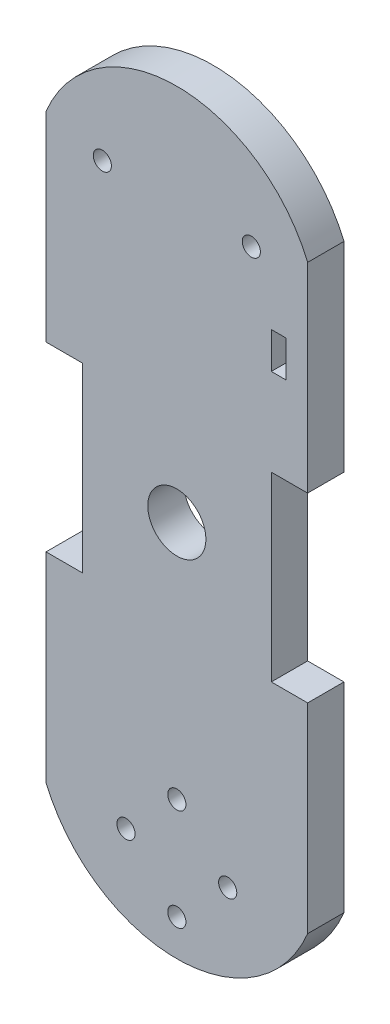
ISO-10303-21;
HEADER;
FILE_DESCRIPTION(('STEP AP214'),'2;1');
FILE_NAME('part.step','',(''),(''),'','','');
FILE_SCHEMA(('AUTOMOTIVE_DESIGN { 1 0 10303 214 1 1 1 1 }'));
ENDSEC;
DATA;
#1=APPLICATION_CONTEXT('core data for automotive mechanical design processes');
#2=APPLICATION_PROTOCOL_DEFINITION('international standard','automotive_design',2000,#1);
#3=PRODUCT_CONTEXT('',#1,'mechanical');
#4=PRODUCT('Part','Part','',(#3));
#5=PRODUCT_RELATED_PRODUCT_CATEGORY('part','',(#4));
#6=PRODUCT_DEFINITION_FORMATION('','',#4);
#7=PRODUCT_DEFINITION_CONTEXT('part definition',#1,'design');
#8=PRODUCT_DEFINITION('design','',#6,#7);
#9=PRODUCT_DEFINITION_SHAPE('','',#8);
#10=(LENGTH_UNIT() NAMED_UNIT(*) SI_UNIT(.MILLI.,.METRE.));
#11=(NAMED_UNIT(*) PLANE_ANGLE_UNIT() SI_UNIT($,.RADIAN.));
#12=(NAMED_UNIT(*) SI_UNIT($,.STERADIAN.) SOLID_ANGLE_UNIT());
#13=UNCERTAINTY_MEASURE_WITH_UNIT(LENGTH_MEASURE(1.E-05),#10,'distance_accuracy_value','');
#14=(GEOMETRIC_REPRESENTATION_CONTEXT(3) GLOBAL_UNCERTAINTY_ASSIGNED_CONTEXT((#13)) GLOBAL_UNIT_ASSIGNED_CONTEXT((#10,
#11,#12)) REPRESENTATION_CONTEXT('',''));
#15=CARTESIAN_POINT('',(0.,0.,0.));
#16=DIRECTION('',(0.,0.,1.));
#17=DIRECTION('',(1.,0.,0.));
#18=AXIS2_PLACEMENT_3D('',#15,#16,#17);
#19=CARTESIAN_POINT('',(0.,7.5,5.));
#20=DIRECTION('',(0.,0.,1.));
#21=DIRECTION('',(1.,0.,0.));
#22=AXIS2_PLACEMENT_3D('',#19,#20,#21);
#23=PLANE('',#22);
#24=CARTESIAN_POINT('',(-10.25,78.,5.));
#25=DIRECTION('',(0.,0.,1.));
#26=DIRECTION('',(1.,0.,0.));
#27=AXIS2_PLACEMENT_3D('',#24,#25,#26);
#28=CIRCLE('',#27,1.25);
#29=CARTESIAN_POINT('',(-9.00000000000001,78.,5.));
#30=VERTEX_POINT('',#29);
#31=EDGE_CURVE('E212',#30,#30,#28,.T.);
#32=ORIENTED_EDGE('',*,*,#31,.F.);
#33=EDGE_LOOP('',(#32));
#34=FACE_BOUND('',#33,.T.);
#35=CARTESIAN_POINT('',(-7.,0.,5.));
#36=DIRECTION('',(0.,0.,1.));
#37=DIRECTION('',(1.,0.,0.));
#38=AXIS2_PLACEMENT_3D('',#35,#36,#37);
#39=CIRCLE('',#38,1.25);
#40=CARTESIAN_POINT('',(-5.75,0.,5.));
#41=VERTEX_POINT('',#40);
#42=EDGE_CURVE('E228',#41,#41,#39,.T.);
#43=ORIENTED_EDGE('',*,*,#42,.F.);
#44=EDGE_LOOP('',(#43));
#45=FACE_BOUND('',#44,.T.);
#46=CARTESIAN_POINT('',(7.,0.,5.));
#47=DIRECTION('',(0.,0.,1.));
#48=DIRECTION('',(1.,0.,0.));
#49=AXIS2_PLACEMENT_3D('',#46,#47,#48);
#50=CIRCLE('',#49,1.25);
#51=CARTESIAN_POINT('',(8.25,0.,5.));
#52=VERTEX_POINT('',#51);
#53=EDGE_CURVE('E244',#52,#52,#50,.T.);
#54=ORIENTED_EDGE('',*,*,#53,.F.);
#55=EDGE_LOOP('',(#54));
#56=FACE_BOUND('',#55,.T.);
#57=CARTESIAN_POINT('',(0.,7.5,5.));
#58=DIRECTION('',(0.,0.,1.));
#59=DIRECTION('',(1.,0.,0.));
#60=AXIS2_PLACEMENT_3D('',#57,#58,#59);
#61=CIRCLE('',#60,19.5);
#62=CARTESIAN_POINT('',(-18.,0.,5.));
#63=VERTEX_POINT('',#62);
#64=CARTESIAN_POINT('',(18.,0.,5.));
#65=VERTEX_POINT('',#64);
#66=EDGE_CURVE('E260',#63,#65,#61,.T.);
#67=ORIENTED_EDGE('',*,*,#66,.T.);
#68=DIRECTION('',(0.,1.,0.));
#69=VECTOR('',#68,1.);
#70=CARTESIAN_POINT('',(18.,27.5,5.));
#71=LINE('',#70,#69);
#72=CARTESIAN_POINT('',(18.,27.5,5.));
#73=VERTEX_POINT('',#72);
#74=EDGE_CURVE('E264',#65,#73,#71,.T.);
#75=ORIENTED_EDGE('',*,*,#74,.T.);
#76=DIRECTION('',(-1.,0.,0.));
#77=VECTOR('',#76,1.);
#78=CARTESIAN_POINT('',(13.,27.5,5.));
#79=LINE('',#78,#77);
#80=CARTESIAN_POINT('',(13.,27.5,5.));
#81=VERTEX_POINT('',#80);
#82=EDGE_CURVE('E268',#73,#81,#79,.T.);
#83=ORIENTED_EDGE('',*,*,#82,.T.);
#84=DIRECTION('',(0.,1.,0.));
#85=VECTOR('',#84,1.);
#86=CARTESIAN_POINT('',(13.,52.5,5.));
#87=LINE('',#86,#85);
#88=CARTESIAN_POINT('',(13.,52.5,5.));
#89=VERTEX_POINT('',#88);
#90=EDGE_CURVE('E271',#81,#89,#87,.T.);
#91=ORIENTED_EDGE('',*,*,#90,.T.);
#92=DIRECTION('',(1.,0.,0.));
#93=VECTOR('',#92,1.);
#94=CARTESIAN_POINT('',(18.,52.5,5.));
#95=LINE('',#94,#93);
#96=CARTESIAN_POINT('',(18.,52.5,5.));
#97=VERTEX_POINT('',#96);
#98=EDGE_CURVE('E274',#89,#97,#95,.T.);
#99=ORIENTED_EDGE('',*,*,#98,.T.);
#100=DIRECTION('',(0.,1.,0.));
#101=VECTOR('',#100,1.);
#102=CARTESIAN_POINT('',(18.,80.,5.));
#103=LINE('',#102,#101);
#104=CARTESIAN_POINT('',(18.,80.,5.));
#105=VERTEX_POINT('',#104);
#106=EDGE_CURVE('E277',#97,#105,#103,.T.);
#107=ORIENTED_EDGE('',*,*,#106,.T.);
#108=CARTESIAN_POINT('',(0.,72.5,5.));
#109=DIRECTION('',(0.,0.,1.));
#110=DIRECTION('',(-1.,0.,0.));
#111=AXIS2_PLACEMENT_3D('',#108,#109,#110);
#112=CIRCLE('',#111,19.5);
#113=CARTESIAN_POINT('',(-18.,80.,5.));
#114=VERTEX_POINT('',#113);
#115=EDGE_CURVE('E280',#105,#114,#112,.T.);
#116=ORIENTED_EDGE('',*,*,#115,.T.);
#117=DIRECTION('',(0.,-1.,0.));
#118=VECTOR('',#117,1.);
#119=CARTESIAN_POINT('',(-18.,80.,5.));
#120=LINE('',#119,#118);
#121=CARTESIAN_POINT('',(-18.,52.5,5.));
#122=VERTEX_POINT('',#121);
#123=EDGE_CURVE('E283',#114,#122,#120,.T.);
#124=ORIENTED_EDGE('',*,*,#123,.T.);
#125=DIRECTION('',(1.,0.,0.));
#126=VECTOR('',#125,1.);
#127=CARTESIAN_POINT('',(-18.,52.5,5.));
#128=LINE('',#127,#126);
#129=CARTESIAN_POINT('',(-13.,52.5,5.));
#130=VERTEX_POINT('',#129);
#131=EDGE_CURVE('E286',#122,#130,#128,.T.);
#132=ORIENTED_EDGE('',*,*,#131,.T.);
#133=DIRECTION('',(0.,-1.,0.));
#134=VECTOR('',#133,1.);
#135=CARTESIAN_POINT('',(-13.,52.5,5.));
#136=LINE('',#135,#134);
#137=CARTESIAN_POINT('',(-13.,27.5,5.));
#138=VERTEX_POINT('',#137);
#139=EDGE_CURVE('E289',#130,#138,#136,.T.);
#140=ORIENTED_EDGE('',*,*,#139,.T.);
#141=DIRECTION('',(-1.,0.,0.));
#142=VECTOR('',#141,1.);
#143=CARTESIAN_POINT('',(-13.,27.5,5.));
#144=LINE('',#143,#142);
#145=CARTESIAN_POINT('',(-18.,27.5,5.));
#146=VERTEX_POINT('',#145);
#147=EDGE_CURVE('E292',#138,#146,#144,.T.);
#148=ORIENTED_EDGE('',*,*,#147,.T.);
#149=DIRECTION('',(0.,-1.,0.));
#150=VECTOR('',#149,1.);
#151=CARTESIAN_POINT('',(-18.,27.5,5.));
#152=LINE('',#151,#150);
#153=EDGE_CURVE('E295',#146,#63,#152,.T.);
#154=ORIENTED_EDGE('',*,*,#153,.T.);
#155=EDGE_LOOP('',(#67,#75,#83,#91,#99,#107,#116,#124,#132,#140,#148,#154));
#156=FACE_BOUND('',#155,.T.);
#157=CARTESIAN_POINT('',(0.,7.,5.));
#158=DIRECTION('',(0.,0.,1.));
#159=DIRECTION('',(1.,0.,0.));
#160=AXIS2_PLACEMENT_3D('',#157,#158,#159);
#161=CIRCLE('',#160,1.25);
#162=CARTESIAN_POINT('',(1.25,7.,5.));
#163=VERTEX_POINT('',#162);
#164=EDGE_CURVE('E252',#163,#163,#161,.T.);
#165=ORIENTED_EDGE('',*,*,#164,.F.);
#166=EDGE_LOOP('',(#165));
#167=FACE_BOUND('',#166,.T.);
#168=CARTESIAN_POINT('',(0.,-7.,5.));
#169=DIRECTION('',(0.,0.,1.));
#170=DIRECTION('',(1.,0.,0.));
#171=AXIS2_PLACEMENT_3D('',#168,#169,#170);
#172=CIRCLE('',#171,1.25);
#173=CARTESIAN_POINT('',(1.25,-7.,5.));
#174=VERTEX_POINT('',#173);
#175=EDGE_CURVE('E236',#174,#174,#172,.T.);
#176=ORIENTED_EDGE('',*,*,#175,.F.);
#177=EDGE_LOOP('',(#176));
#178=FACE_BOUND('',#177,.T.);
#179=CARTESIAN_POINT('',(0.,40.,5.));
#180=DIRECTION('',(0.,0.,1.));
#181=DIRECTION('',(1.,0.,0.));
#182=AXIS2_PLACEMENT_3D('',#179,#180,#181);
#183=CIRCLE('',#182,4.);
#184=CARTESIAN_POINT('',(4.,40.,5.));
#185=VERTEX_POINT('',#184);
#186=EDGE_CURVE('E220',#185,#185,#183,.T.);
#187=ORIENTED_EDGE('',*,*,#186,.F.);
#188=EDGE_LOOP('',(#187));
#189=FACE_BOUND('',#188,.T.);
#190=CARTESIAN_POINT('',(10.25,78.,5.));
#191=DIRECTION('',(0.,0.,1.));
#192=DIRECTION('',(1.,0.,0.));
#193=AXIS2_PLACEMENT_3D('',#190,#191,#192);
#194=CIRCLE('',#193,1.25);
#195=CARTESIAN_POINT('',(11.5,78.,5.));
#196=VERTEX_POINT('',#195);
#197=EDGE_CURVE('E204',#196,#196,#194,.T.);
#198=ORIENTED_EDGE('',*,*,#197,.F.);
#199=EDGE_LOOP('',(#198));
#200=FACE_BOUND('',#199,.T.);
#201=DIRECTION('',(1.,0.,0.));
#202=VECTOR('',#201,1.);
#203=CARTESIAN_POINT('',(13.,64.5,5.));
#204=LINE('',#203,#202);
#205=CARTESIAN_POINT('',(13.,64.5,5.));
#206=VERTEX_POINT('',#205);
#207=CARTESIAN_POINT('',(15.,64.5,5.));
#208=VERTEX_POINT('',#207);
#209=EDGE_CURVE('E165',#206,#208,#204,.T.);
#210=ORIENTED_EDGE('',*,*,#209,.F.);
#211=DIRECTION('',(0.,-1.,0.));
#212=VECTOR('',#211,1.);
#213=CARTESIAN_POINT('',(13.,69.5,5.));
#214=LINE('',#213,#212);
#215=CARTESIAN_POINT('',(13.,69.5,5.));
#216=VERTEX_POINT('',#215);
#217=EDGE_CURVE('E156',#216,#206,#214,.T.);
#218=ORIENTED_EDGE('',*,*,#217,.F.);
#219=DIRECTION('',(-1.,0.,0.));
#220=VECTOR('',#219,1.);
#221=CARTESIAN_POINT('',(13.,69.5,5.));
#222=LINE('',#221,#220);
#223=CARTESIAN_POINT('',(15.,69.5,5.));
#224=VERTEX_POINT('',#223);
#225=EDGE_CURVE('E182',#224,#216,#222,.T.);
#226=ORIENTED_EDGE('',*,*,#225,.F.);
#227=DIRECTION('',(0.,1.,0.));
#228=VECTOR('',#227,1.);
#229=CARTESIAN_POINT('',(15.,69.5,5.));
#230=LINE('',#229,#228);
#231=EDGE_CURVE('E178',#208,#224,#230,.T.);
#232=ORIENTED_EDGE('',*,*,#231,.F.);
#233=EDGE_LOOP('',(#210,#218,#226,#232));
#234=FACE_BOUND('',#233,.T.);
#235=ADVANCED_FACE('F42',(#34,#45,#56,#156,#167,#178,#189,#200,#234),#23,.T.);
#236=CARTESIAN_POINT('',(0.,7.5,0.));
#237=DIRECTION('',(0.,0.,1.));
#238=DIRECTION('',(1.,0.,0.));
#239=AXIS2_PLACEMENT_3D('',#236,#237,#238);
#240=PLANE('',#239);
#241=CARTESIAN_POINT('',(10.25,78.,0.));
#242=DIRECTION('',(0.,0.,1.));
#243=DIRECTION('',(1.,0.,0.));
#244=AXIS2_PLACEMENT_3D('',#241,#242,#243);
#245=CIRCLE('',#244,1.25);
#246=CARTESIAN_POINT('',(11.5,78.,0.));
#247=VERTEX_POINT('',#246);
#248=EDGE_CURVE('E174',#247,#247,#245,.T.);
#249=ORIENTED_EDGE('',*,*,#248,.T.);
#250=EDGE_LOOP('',(#249));
#251=FACE_BOUND('',#250,.T.);
#252=CARTESIAN_POINT('',(-10.25,78.,0.));
#253=DIRECTION('',(0.,0.,1.));
#254=DIRECTION('',(1.,0.,0.));
#255=AXIS2_PLACEMENT_3D('',#252,#253,#254);
#256=CIRCLE('',#255,1.25);
#257=CARTESIAN_POINT('',(-9.00000000000001,78.,0.));
#258=VERTEX_POINT('',#257);
#259=EDGE_CURVE('E208',#258,#258,#256,.T.);
#260=ORIENTED_EDGE('',*,*,#259,.T.);
#261=EDGE_LOOP('',(#260));
#262=FACE_BOUND('',#261,.T.);
#263=CARTESIAN_POINT('',(0.,40.,0.));
#264=DIRECTION('',(0.,0.,1.));
#265=DIRECTION('',(1.,0.,0.));
#266=AXIS2_PLACEMENT_3D('',#263,#264,#265);
#267=CIRCLE('',#266,4.);
#268=CARTESIAN_POINT('',(4.,40.,0.));
#269=VERTEX_POINT('',#268);
#270=EDGE_CURVE('E216',#269,#269,#267,.T.);
#271=ORIENTED_EDGE('',*,*,#270,.T.);
#272=EDGE_LOOP('',(#271));
#273=FACE_BOUND('',#272,.T.);
#274=CARTESIAN_POINT('',(-7.,0.,0.));
#275=DIRECTION('',(0.,0.,1.));
#276=DIRECTION('',(1.,0.,0.));
#277=AXIS2_PLACEMENT_3D('',#274,#275,#276);
#278=CIRCLE('',#277,1.25);
#279=CARTESIAN_POINT('',(-5.75,0.,0.));
#280=VERTEX_POINT('',#279);
#281=EDGE_CURVE('E224',#280,#280,#278,.T.);
#282=ORIENTED_EDGE('',*,*,#281,.T.);
#283=EDGE_LOOP('',(#282));
#284=FACE_BOUND('',#283,.T.);
#285=CARTESIAN_POINT('',(0.,-7.,0.));
#286=DIRECTION('',(0.,0.,1.));
#287=DIRECTION('',(1.,0.,0.));
#288=AXIS2_PLACEMENT_3D('',#285,#286,#287);
#289=CIRCLE('',#288,1.25);
#290=CARTESIAN_POINT('',(1.25,-7.,0.));
#291=VERTEX_POINT('',#290);
#292=EDGE_CURVE('E232',#291,#291,#289,.T.);
#293=ORIENTED_EDGE('',*,*,#292,.T.);
#294=EDGE_LOOP('',(#293));
#295=FACE_BOUND('',#294,.T.);
#296=CARTESIAN_POINT('',(7.,0.,0.));
#297=DIRECTION('',(0.,0.,1.));
#298=DIRECTION('',(1.,0.,0.));
#299=AXIS2_PLACEMENT_3D('',#296,#297,#298);
#300=CIRCLE('',#299,1.25);
#301=CARTESIAN_POINT('',(8.25,0.,0.));
#302=VERTEX_POINT('',#301);
#303=EDGE_CURVE('E240',#302,#302,#300,.T.);
#304=ORIENTED_EDGE('',*,*,#303,.T.);
#305=EDGE_LOOP('',(#304));
#306=FACE_BOUND('',#305,.T.);
#307=CARTESIAN_POINT('',(0.,7.,0.));
#308=DIRECTION('',(0.,0.,1.));
#309=DIRECTION('',(1.,0.,0.));
#310=AXIS2_PLACEMENT_3D('',#307,#308,#309);
#311=CIRCLE('',#310,1.25);
#312=CARTESIAN_POINT('',(1.25,7.,0.));
#313=VERTEX_POINT('',#312);
#314=EDGE_CURVE('E248',#313,#313,#311,.T.);
#315=ORIENTED_EDGE('',*,*,#314,.T.);
#316=EDGE_LOOP('',(#315));
#317=FACE_BOUND('',#316,.T.);
#318=CARTESIAN_POINT('',(0.,7.5,0.));
#319=DIRECTION('',(0.,0.,1.));
#320=DIRECTION('',(1.,0.,0.));
#321=AXIS2_PLACEMENT_3D('',#318,#319,#320);
#322=CIRCLE('',#321,19.5);
#323=CARTESIAN_POINT('',(-18.,0.,0.));
#324=VERTEX_POINT('',#323);
#325=CARTESIAN_POINT('',(18.,0.,0.));
#326=VERTEX_POINT('',#325);
#327=EDGE_CURVE('E256',#324,#326,#322,.T.);
#328=ORIENTED_EDGE('',*,*,#327,.F.);
#329=DIRECTION('',(0.,-1.,0.));
#330=VECTOR('',#329,1.);
#331=CARTESIAN_POINT('',(-18.,27.5,0.));
#332=LINE('',#331,#330);
#333=CARTESIAN_POINT('',(-18.,27.5,0.));
#334=VERTEX_POINT('',#333);
#335=EDGE_CURVE('E265',#334,#324,#332,.T.);
#336=ORIENTED_EDGE('',*,*,#335,.F.);
#337=DIRECTION('',(-1.,0.,0.));
#338=VECTOR('',#337,1.);
#339=CARTESIAN_POINT('',(-13.,27.5,0.));
#340=LINE('',#339,#338);
#341=CARTESIAN_POINT('',(-13.,27.5,0.));
#342=VERTEX_POINT('',#341);
#343=EDGE_CURVE('E329',#342,#334,#340,.T.);
#344=ORIENTED_EDGE('',*,*,#343,.F.);
#345=DIRECTION('',(0.,-1.,0.));
#346=VECTOR('',#345,1.);
#347=CARTESIAN_POINT('',(-13.,52.5,0.));
#348=LINE('',#347,#346);
#349=CARTESIAN_POINT('',(-13.,52.5,0.));
#350=VERTEX_POINT('',#349);
#351=EDGE_CURVE('E326',#350,#342,#348,.T.);
#352=ORIENTED_EDGE('',*,*,#351,.F.);
#353=DIRECTION('',(1.,0.,0.));
#354=VECTOR('',#353,1.);
#355=CARTESIAN_POINT('',(-18.,52.5,0.));
#356=LINE('',#355,#354);
#357=CARTESIAN_POINT('',(-18.,52.5,0.));
#358=VERTEX_POINT('',#357);
#359=EDGE_CURVE('E323',#358,#350,#356,.T.);
#360=ORIENTED_EDGE('',*,*,#359,.F.);
#361=DIRECTION('',(0.,-1.,0.));
#362=VECTOR('',#361,1.);
#363=CARTESIAN_POINT('',(-18.,80.,0.));
#364=LINE('',#363,#362);
#365=CARTESIAN_POINT('',(-18.,80.,0.));
#366=VERTEX_POINT('',#365);
#367=EDGE_CURVE('E320',#366,#358,#364,.T.);
#368=ORIENTED_EDGE('',*,*,#367,.F.);
#369=CARTESIAN_POINT('',(0.,72.5,0.));
#370=DIRECTION('',(0.,0.,1.));
#371=DIRECTION('',(-1.,0.,0.));
#372=AXIS2_PLACEMENT_3D('',#369,#370,#371);
#373=CIRCLE('',#372,19.5);
#374=CARTESIAN_POINT('',(18.,80.,0.));
#375=VERTEX_POINT('',#374);
#376=EDGE_CURVE('E317',#375,#366,#373,.T.);
#377=ORIENTED_EDGE('',*,*,#376,.F.);
#378=DIRECTION('',(0.,1.,0.));
#379=VECTOR('',#378,1.);
#380=CARTESIAN_POINT('',(18.,80.,0.));
#381=LINE('',#380,#379);
#382=CARTESIAN_POINT('',(18.,52.5,0.));
#383=VERTEX_POINT('',#382);
#384=EDGE_CURVE('E314',#383,#375,#381,.T.);
#385=ORIENTED_EDGE('',*,*,#384,.F.);
#386=DIRECTION('',(1.,0.,0.));
#387=VECTOR('',#386,1.);
#388=CARTESIAN_POINT('',(18.,52.5,0.));
#389=LINE('',#388,#387);
#390=CARTESIAN_POINT('',(13.,52.5,0.));
#391=VERTEX_POINT('',#390);
#392=EDGE_CURVE('E311',#391,#383,#389,.T.);
#393=ORIENTED_EDGE('',*,*,#392,.F.);
#394=DIRECTION('',(0.,1.,0.));
#395=VECTOR('',#394,1.);
#396=CARTESIAN_POINT('',(13.,52.5,0.));
#397=LINE('',#396,#395);
#398=CARTESIAN_POINT('',(13.,27.5,0.));
#399=VERTEX_POINT('',#398);
#400=EDGE_CURVE('E308',#399,#391,#397,.T.);
#401=ORIENTED_EDGE('',*,*,#400,.F.);
#402=DIRECTION('',(-1.,0.,0.));
#403=VECTOR('',#402,1.);
#404=CARTESIAN_POINT('',(13.,27.5,0.));
#405=LINE('',#404,#403);
#406=CARTESIAN_POINT('',(18.,27.5,0.));
#407=VERTEX_POINT('',#406);
#408=EDGE_CURVE('E305',#407,#399,#405,.T.);
#409=ORIENTED_EDGE('',*,*,#408,.F.);
#410=DIRECTION('',(0.,1.,0.));
#411=VECTOR('',#410,1.);
#412=CARTESIAN_POINT('',(18.,27.5,0.));
#413=LINE('',#412,#411);
#414=EDGE_CURVE('E302',#326,#407,#413,.T.);
#415=ORIENTED_EDGE('',*,*,#414,.F.);
#416=EDGE_LOOP('',(#328,#336,#344,#352,#360,#368,#377,#385,#393,#401,#409,#415));
#417=FACE_BOUND('',#416,.T.);
#418=DIRECTION('',(0.,-1.,0.));
#419=VECTOR('',#418,1.);
#420=CARTESIAN_POINT('',(13.,69.5,0.));
#421=LINE('',#420,#419);
#422=CARTESIAN_POINT('',(13.,69.5,0.));
#423=VERTEX_POINT('',#422);
#424=CARTESIAN_POINT('',(13.,64.5,0.));
#425=VERTEX_POINT('',#424);
#426=EDGE_CURVE('E66',#423,#425,#421,.T.);
#427=ORIENTED_EDGE('',*,*,#426,.T.);
#428=DIRECTION('',(1.,0.,0.));
#429=VECTOR('',#428,1.);
#430=CARTESIAN_POINT('',(13.,64.5,0.));
#431=LINE('',#430,#429);
#432=CARTESIAN_POINT('',(15.,64.5,0.));
#433=VERTEX_POINT('',#432);
#434=EDGE_CURVE('E172',#425,#433,#431,.T.);
#435=ORIENTED_EDGE('',*,*,#434,.T.);
#436=DIRECTION('',(0.,1.,0.));
#437=VECTOR('',#436,1.);
#438=CARTESIAN_POINT('',(15.,69.5,0.));
#439=LINE('',#438,#437);
#440=CARTESIAN_POINT('',(15.,69.5,0.));
#441=VERTEX_POINT('',#440);
#442=EDGE_CURVE('E191',#433,#441,#439,.T.);
#443=ORIENTED_EDGE('',*,*,#442,.T.);
#444=DIRECTION('',(-1.,0.,0.));
#445=VECTOR('',#444,1.);
#446=CARTESIAN_POINT('',(13.,69.5,0.));
#447=LINE('',#446,#445);
#448=EDGE_CURVE('E166',#441,#423,#447,.T.);
#449=ORIENTED_EDGE('',*,*,#448,.T.);
#450=EDGE_LOOP('',(#427,#435,#443,#449));
#451=FACE_BOUND('',#450,.T.);
#452=ADVANCED_FACE('F384',(#251,#262,#273,#284,#295,#306,#317,#417,#451),#240,.F.);
#453=CARTESIAN_POINT('',(0.,7.5,5.));
#454=DIRECTION('',(0.,0.,-1.));
#455=DIRECTION('',(-1.,0.,0.));
#456=AXIS2_PLACEMENT_3D('',#453,#454,#455);
#457=CYLINDRICAL_SURFACE('',#456,19.5);
#458=ORIENTED_EDGE('',*,*,#327,.T.);
#459=DIRECTION('',(0.,0.,-1.));
#460=VECTOR('',#459,1.);
#461=CARTESIAN_POINT('',(18.,0.,5.));
#462=LINE('',#461,#460);
#463=EDGE_CURVE('E11',#65,#326,#462,.T.);
#464=ORIENTED_EDGE('',*,*,#463,.F.);
#465=ORIENTED_EDGE('',*,*,#66,.F.);
#466=DIRECTION('',(0.,0.,-1.));
#467=VECTOR('',#466,1.);
#468=CARTESIAN_POINT('',(-18.,0.,5.));
#469=LINE('',#468,#467);
#470=EDGE_CURVE('E298',#63,#324,#469,.T.);
#471=ORIENTED_EDGE('',*,*,#470,.T.);
#472=EDGE_LOOP('',(#458,#464,#465,#471));
#473=FACE_BOUND('',#472,.T.);
#474=ADVANCED_FACE('F44',(#473),#457,.T.);
#475=CARTESIAN_POINT('',(18.,27.5,5.));
#476=DIRECTION('',(-1.,0.,0.));
#477=DIRECTION('',(0.,0.,1.));
#478=AXIS2_PLACEMENT_3D('',#475,#476,#477);
#479=PLANE('',#478);
#480=ORIENTED_EDGE('',*,*,#414,.T.);
#481=DIRECTION('',(0.,0.,-1.));
#482=VECTOR('',#481,1.);
#483=CARTESIAN_POINT('',(18.,27.5,5.));
#484=LINE('',#483,#482);
#485=EDGE_CURVE('E51',#73,#407,#484,.T.);
#486=ORIENTED_EDGE('',*,*,#485,.F.);
#487=ORIENTED_EDGE('',*,*,#74,.F.);
#488=ORIENTED_EDGE('',*,*,#463,.T.);
#489=EDGE_LOOP('',(#480,#486,#487,#488));
#490=FACE_BOUND('',#489,.T.);
#491=ADVANCED_FACE('F402',(#490),#479,.F.);
#492=CARTESIAN_POINT('',(13.,27.5,5.));
#493=DIRECTION('',(0.,-1.,0.));
#494=DIRECTION('',(0.,0.,-1.));
#495=AXIS2_PLACEMENT_3D('',#492,#493,#494);
#496=PLANE('',#495);
#497=ORIENTED_EDGE('',*,*,#408,.T.);
#498=DIRECTION('',(0.,0.,-1.));
#499=VECTOR('',#498,1.);
#500=CARTESIAN_POINT('',(13.,27.5,5.));
#501=LINE('',#500,#499);
#502=EDGE_CURVE('E369',#81,#399,#501,.T.);
#503=ORIENTED_EDGE('',*,*,#502,.F.);
#504=ORIENTED_EDGE('',*,*,#82,.F.);
#505=ORIENTED_EDGE('',*,*,#485,.T.);
#506=EDGE_LOOP('',(#497,#503,#504,#505));
#507=FACE_BOUND('',#506,.T.);
#508=ADVANCED_FACE('F378',(#507),#496,.F.);
#509=CARTESIAN_POINT('',(13.,52.5,5.));
#510=DIRECTION('',(-1.,0.,0.));
#511=DIRECTION('',(0.,-1.,0.));
#512=AXIS2_PLACEMENT_3D('',#509,#510,#511);
#513=PLANE('',#512);
#514=ORIENTED_EDGE('',*,*,#400,.T.);
#515=DIRECTION('',(0.,0.,-1.));
#516=VECTOR('',#515,1.);
#517=CARTESIAN_POINT('',(13.,52.5,5.));
#518=LINE('',#517,#516);
#519=EDGE_CURVE('E365',#89,#391,#518,.T.);
#520=ORIENTED_EDGE('',*,*,#519,.F.);
#521=ORIENTED_EDGE('',*,*,#90,.F.);
#522=ORIENTED_EDGE('',*,*,#502,.T.);
#523=EDGE_LOOP('',(#514,#520,#521,#522));
#524=FACE_BOUND('',#523,.T.);
#525=ADVANCED_FACE('F390',(#524),#513,.F.);
#526=CARTESIAN_POINT('',(18.,52.5,5.));
#527=DIRECTION('',(0.,1.,0.));
#528=DIRECTION('',(0.,0.,1.));
#529=AXIS2_PLACEMENT_3D('',#526,#527,#528);
#530=PLANE('',#529);
#531=ORIENTED_EDGE('',*,*,#392,.T.);
#532=DIRECTION('',(0.,0.,-1.));
#533=VECTOR('',#532,1.);
#534=CARTESIAN_POINT('',(18.,52.5,5.));
#535=LINE('',#534,#533);
#536=EDGE_CURVE('E361',#97,#383,#535,.T.);
#537=ORIENTED_EDGE('',*,*,#536,.F.);
#538=ORIENTED_EDGE('',*,*,#98,.F.);
#539=ORIENTED_EDGE('',*,*,#519,.T.);
#540=EDGE_LOOP('',(#531,#537,#538,#539));
#541=FACE_BOUND('',#540,.T.);
#542=ADVANCED_FACE('F394',(#541),#530,.F.);
#543=CARTESIAN_POINT('',(18.,80.,5.));
#544=DIRECTION('',(-1.,0.,0.));
#545=DIRECTION('',(0.,0.,1.));
#546=AXIS2_PLACEMENT_3D('',#543,#544,#545);
#547=PLANE('',#546);
#548=ORIENTED_EDGE('',*,*,#384,.T.);
#549=DIRECTION('',(0.,0.,-1.));
#550=VECTOR('',#549,1.);
#551=CARTESIAN_POINT('',(18.,80.,5.));
#552=LINE('',#551,#550);
#553=EDGE_CURVE('E357',#105,#375,#552,.T.);
#554=ORIENTED_EDGE('',*,*,#553,.F.);
#555=ORIENTED_EDGE('',*,*,#106,.F.);
#556=ORIENTED_EDGE('',*,*,#536,.T.);
#557=EDGE_LOOP('',(#548,#554,#555,#556));
#558=FACE_BOUND('',#557,.T.);
#559=ADVANCED_FACE('F435',(#558),#547,.F.);
#560=CARTESIAN_POINT('',(0.,72.5,5.));
#561=DIRECTION('',(0.,0.,-1.));
#562=DIRECTION('',(-1.,0.,0.));
#563=AXIS2_PLACEMENT_3D('',#560,#561,#562);
#564=CYLINDRICAL_SURFACE('',#563,19.5);
#565=ORIENTED_EDGE('',*,*,#376,.T.);
#566=DIRECTION('',(0.,0.,-1.));
#567=VECTOR('',#566,1.);
#568=CARTESIAN_POINT('',(-18.,80.,5.));
#569=LINE('',#568,#567);
#570=EDGE_CURVE('E353',#114,#366,#569,.T.);
#571=ORIENTED_EDGE('',*,*,#570,.F.);
#572=ORIENTED_EDGE('',*,*,#115,.F.);
#573=ORIENTED_EDGE('',*,*,#553,.T.);
#574=EDGE_LOOP('',(#565,#571,#572,#573));
#575=FACE_BOUND('',#574,.T.);
#576=ADVANCED_FACE('F433',(#575),#564,.T.);
#577=CARTESIAN_POINT('',(-18.,80.,5.));
#578=DIRECTION('',(1.,0.,0.));
#579=DIRECTION('',(0.,1.,0.));
#580=AXIS2_PLACEMENT_3D('',#577,#578,#579);
#581=PLANE('',#580);
#582=ORIENTED_EDGE('',*,*,#367,.T.);
#583=DIRECTION('',(0.,0.,-1.));
#584=VECTOR('',#583,1.);
#585=CARTESIAN_POINT('',(-18.,52.5,5.));
#586=LINE('',#585,#584);
#587=EDGE_CURVE('E349',#122,#358,#586,.T.);
#588=ORIENTED_EDGE('',*,*,#587,.F.);
#589=ORIENTED_EDGE('',*,*,#123,.F.);
#590=ORIENTED_EDGE('',*,*,#570,.T.);
#591=EDGE_LOOP('',(#582,#588,#589,#590));
#592=FACE_BOUND('',#591,.T.);
#593=ADVANCED_FACE('F429',(#592),#581,.F.);
#594=CARTESIAN_POINT('',(-18.,52.5,5.));
#595=DIRECTION('',(0.,1.,0.));
#596=DIRECTION('',(0.,0.,1.));
#597=AXIS2_PLACEMENT_3D('',#594,#595,#596);
#598=PLANE('',#597);
#599=ORIENTED_EDGE('',*,*,#359,.T.);
#600=DIRECTION('',(0.,0.,-1.));
#601=VECTOR('',#600,1.);
#602=CARTESIAN_POINT('',(-13.,52.5,5.));
#603=LINE('',#602,#601);
#604=EDGE_CURVE('E345',#130,#350,#603,.T.);
#605=ORIENTED_EDGE('',*,*,#604,.F.);
#606=ORIENTED_EDGE('',*,*,#131,.F.);
#607=ORIENTED_EDGE('',*,*,#587,.T.);
#608=EDGE_LOOP('',(#599,#605,#606,#607));
#609=FACE_BOUND('',#608,.T.);
#610=ADVANCED_FACE('F424',(#609),#598,.F.);
#611=CARTESIAN_POINT('',(-13.,52.5,5.));
#612=DIRECTION('',(1.,0.,0.));
#613=DIRECTION('',(0.,1.,0.));
#614=AXIS2_PLACEMENT_3D('',#611,#612,#613);
#615=PLANE('',#614);
#616=ORIENTED_EDGE('',*,*,#351,.T.);
#617=DIRECTION('',(0.,0.,-1.));
#618=VECTOR('',#617,1.);
#619=CARTESIAN_POINT('',(-13.,27.5,5.));
#620=LINE('',#619,#618);
#621=EDGE_CURVE('E341',#138,#342,#620,.T.);
#622=ORIENTED_EDGE('',*,*,#621,.F.);
#623=ORIENTED_EDGE('',*,*,#139,.F.);
#624=ORIENTED_EDGE('',*,*,#604,.T.);
#625=EDGE_LOOP('',(#616,#622,#623,#624));
#626=FACE_BOUND('',#625,.T.);
#627=ADVANCED_FACE('F418',(#626),#615,.F.);
#628=CARTESIAN_POINT('',(-13.,27.5,5.));
#629=DIRECTION('',(0.,-1.,0.));
#630=DIRECTION('',(0.,0.,-1.));
#631=AXIS2_PLACEMENT_3D('',#628,#629,#630);
#632=PLANE('',#631);
#633=ORIENTED_EDGE('',*,*,#343,.T.);
#634=DIRECTION('',(0.,0.,-1.));
#635=VECTOR('',#634,1.);
#636=CARTESIAN_POINT('',(-18.,27.5,5.));
#637=LINE('',#636,#635);
#638=EDGE_CURVE('E337',#146,#334,#637,.T.);
#639=ORIENTED_EDGE('',*,*,#638,.F.);
#640=ORIENTED_EDGE('',*,*,#147,.F.);
#641=ORIENTED_EDGE('',*,*,#621,.T.);
#642=EDGE_LOOP('',(#633,#639,#640,#641));
#643=FACE_BOUND('',#642,.T.);
#644=ADVANCED_FACE('F414',(#643),#632,.F.);
#645=CARTESIAN_POINT('',(-18.,27.5,5.));
#646=DIRECTION('',(1.,0.,0.));
#647=DIRECTION('',(0.,1.,0.));
#648=AXIS2_PLACEMENT_3D('',#645,#646,#647);
#649=PLANE('',#648);
#650=ORIENTED_EDGE('',*,*,#335,.T.);
#651=ORIENTED_EDGE('',*,*,#470,.F.);
#652=ORIENTED_EDGE('',*,*,#153,.F.);
#653=ORIENTED_EDGE('',*,*,#638,.T.);
#654=EDGE_LOOP('',(#650,#651,#652,#653));
#655=FACE_BOUND('',#654,.T.);
#656=ADVANCED_FACE('F409',(#655),#649,.F.);
#657=CARTESIAN_POINT('',(0.,7.,5.));
#658=DIRECTION('',(0.,0.,-1.));
#659=DIRECTION('',(-1.,0.,0.));
#660=AXIS2_PLACEMENT_3D('',#657,#658,#659);
#661=CYLINDRICAL_SURFACE('',#660,1.25);
#662=ORIENTED_EDGE('',*,*,#164,.T.);
#663=EDGE_LOOP('',(#662));
#664=FACE_BOUND('',#663,.T.);
#665=ORIENTED_EDGE('',*,*,#314,.F.);
#666=EDGE_LOOP('',(#665));
#667=FACE_BOUND('',#666,.T.);
#668=ADVANCED_FACE('F455',(#664,#667),#661,.F.);
#669=CARTESIAN_POINT('',(7.,0.,5.));
#670=DIRECTION('',(0.,0.,-1.));
#671=DIRECTION('',(-1.,0.,0.));
#672=AXIS2_PLACEMENT_3D('',#669,#670,#671);
#673=CYLINDRICAL_SURFACE('',#672,1.25);
#674=ORIENTED_EDGE('',*,*,#53,.T.);
#675=EDGE_LOOP('',(#674));
#676=FACE_BOUND('',#675,.T.);
#677=ORIENTED_EDGE('',*,*,#303,.F.);
#678=EDGE_LOOP('',(#677));
#679=FACE_BOUND('',#678,.T.);
#680=ADVANCED_FACE('F493',(#676,#679),#673,.F.);
#681=CARTESIAN_POINT('',(0.,-7.,5.));
#682=DIRECTION('',(0.,0.,-1.));
#683=DIRECTION('',(-1.,0.,0.));
#684=AXIS2_PLACEMENT_3D('',#681,#682,#683);
#685=CYLINDRICAL_SURFACE('',#684,1.25);
#686=ORIENTED_EDGE('',*,*,#175,.T.);
#687=EDGE_LOOP('',(#686));
#688=FACE_BOUND('',#687,.T.);
#689=ORIENTED_EDGE('',*,*,#292,.F.);
#690=EDGE_LOOP('',(#689));
#691=FACE_BOUND('',#690,.T.);
#692=ADVANCED_FACE('F500',(#688,#691),#685,.F.);
#693=CARTESIAN_POINT('',(-7.,0.,5.));
#694=DIRECTION('',(0.,0.,-1.));
#695=DIRECTION('',(-1.,0.,0.));
#696=AXIS2_PLACEMENT_3D('',#693,#694,#695);
#697=CYLINDRICAL_SURFACE('',#696,1.25);
#698=ORIENTED_EDGE('',*,*,#42,.T.);
#699=EDGE_LOOP('',(#698));
#700=FACE_BOUND('',#699,.T.);
#701=ORIENTED_EDGE('',*,*,#281,.F.);
#702=EDGE_LOOP('',(#701));
#703=FACE_BOUND('',#702,.T.);
#704=ADVANCED_FACE('F507',(#700,#703),#697,.F.);
#705=CARTESIAN_POINT('',(0.,40.,5.));
#706=DIRECTION('',(0.,0.,-1.));
#707=DIRECTION('',(-1.,0.,0.));
#708=AXIS2_PLACEMENT_3D('',#705,#706,#707);
#709=CYLINDRICAL_SURFACE('',#708,4.);
#710=ORIENTED_EDGE('',*,*,#186,.T.);
#711=EDGE_LOOP('',(#710));
#712=FACE_BOUND('',#711,.T.);
#713=ORIENTED_EDGE('',*,*,#270,.F.);
#714=EDGE_LOOP('',(#713));
#715=FACE_BOUND('',#714,.T.);
#716=ADVANCED_FACE('F515',(#712,#715),#709,.F.);
#717=CARTESIAN_POINT('',(-10.25,78.,5.));
#718=DIRECTION('',(0.,0.,-1.));
#719=DIRECTION('',(-1.,0.,0.));
#720=AXIS2_PLACEMENT_3D('',#717,#718,#719);
#721=CYLINDRICAL_SURFACE('',#720,1.25);
#722=ORIENTED_EDGE('',*,*,#31,.T.);
#723=EDGE_LOOP('',(#722));
#724=FACE_BOUND('',#723,.T.);
#725=ORIENTED_EDGE('',*,*,#259,.F.);
#726=EDGE_LOOP('',(#725));
#727=FACE_BOUND('',#726,.T.);
#728=ADVANCED_FACE('F523',(#724,#727),#721,.F.);
#729=CARTESIAN_POINT('',(10.25,78.,5.));
#730=DIRECTION('',(0.,0.,-1.));
#731=DIRECTION('',(-1.,0.,0.));
#732=AXIS2_PLACEMENT_3D('',#729,#730,#731);
#733=CYLINDRICAL_SURFACE('',#732,1.25);
#734=ORIENTED_EDGE('',*,*,#197,.T.);
#735=EDGE_LOOP('',(#734));
#736=FACE_BOUND('',#735,.T.);
#737=ORIENTED_EDGE('',*,*,#248,.F.);
#738=EDGE_LOOP('',(#737));
#739=FACE_BOUND('',#738,.T.);
#740=ADVANCED_FACE('F531',(#736,#739),#733,.F.);
#741=CARTESIAN_POINT('',(13.,69.5,5.));
#742=DIRECTION('',(1.,0.,0.));
#743=DIRECTION('',(0.,0.,-1.));
#744=AXIS2_PLACEMENT_3D('',#741,#742,#743);
#745=PLANE('',#744);
#746=ORIENTED_EDGE('',*,*,#426,.F.);
#747=DIRECTION('',(0.,0.,-1.));
#748=VECTOR('',#747,1.);
#749=CARTESIAN_POINT('',(13.,69.5,5.));
#750=LINE('',#749,#748);
#751=EDGE_CURVE('E160',#216,#423,#750,.T.);
#752=ORIENTED_EDGE('',*,*,#751,.F.);
#753=ORIENTED_EDGE('',*,*,#217,.T.);
#754=DIRECTION('',(0.,0.,-1.));
#755=VECTOR('',#754,1.);
#756=CARTESIAN_POINT('',(13.,64.5,5.));
#757=LINE('',#756,#755);
#758=EDGE_CURVE('E159',#206,#425,#757,.T.);
#759=ORIENTED_EDGE('',*,*,#758,.T.);
#760=EDGE_LOOP('',(#746,#752,#753,#759));
#761=FACE_BOUND('',#760,.T.);
#762=ADVANCED_FACE('F158',(#761),#745,.T.);
#763=CARTESIAN_POINT('',(13.,64.5,5.));
#764=DIRECTION('',(0.,1.,0.));
#765=DIRECTION('',(0.,0.,1.));
#766=AXIS2_PLACEMENT_3D('',#763,#764,#765);
#767=PLANE('',#766);
#768=ORIENTED_EDGE('',*,*,#434,.F.);
#769=ORIENTED_EDGE('',*,*,#758,.F.);
#770=ORIENTED_EDGE('',*,*,#209,.T.);
#771=DIRECTION('',(0.,0.,-1.));
#772=VECTOR('',#771,1.);
#773=CARTESIAN_POINT('',(15.,64.5,5.));
#774=LINE('',#773,#772);
#775=EDGE_CURVE('E175',#208,#433,#774,.T.);
#776=ORIENTED_EDGE('',*,*,#775,.T.);
#777=EDGE_LOOP('',(#768,#769,#770,#776));
#778=FACE_BOUND('',#777,.T.);
#779=ADVANCED_FACE('F169',(#778),#767,.T.);
#780=CARTESIAN_POINT('',(15.,69.5,5.));
#781=DIRECTION('',(-1.,0.,0.));
#782=DIRECTION('',(0.,-1.,0.));
#783=AXIS2_PLACEMENT_3D('',#780,#781,#782);
#784=PLANE('',#783);
#785=ORIENTED_EDGE('',*,*,#442,.F.);
#786=ORIENTED_EDGE('',*,*,#775,.F.);
#787=ORIENTED_EDGE('',*,*,#231,.T.);
#788=DIRECTION('',(0.,0.,-1.));
#789=VECTOR('',#788,1.);
#790=CARTESIAN_POINT('',(15.,69.5,5.));
#791=LINE('',#790,#789);
#792=EDGE_CURVE('E58',#224,#441,#791,.T.);
#793=ORIENTED_EDGE('',*,*,#792,.T.);
#794=EDGE_LOOP('',(#785,#786,#787,#793));
#795=FACE_BOUND('',#794,.T.);
#796=ADVANCED_FACE('F552',(#795),#784,.T.);
#797=CARTESIAN_POINT('',(13.,69.5,5.));
#798=DIRECTION('',(0.,-1.,0.));
#799=DIRECTION('',(0.,0.,-1.));
#800=AXIS2_PLACEMENT_3D('',#797,#798,#799);
#801=PLANE('',#800);
#802=ORIENTED_EDGE('',*,*,#448,.F.);
#803=ORIENTED_EDGE('',*,*,#792,.F.);
#804=ORIENTED_EDGE('',*,*,#225,.T.);
#805=ORIENTED_EDGE('',*,*,#751,.T.);
#806=EDGE_LOOP('',(#802,#803,#804,#805));
#807=FACE_BOUND('',#806,.T.);
#808=ADVANCED_FACE('F559',(#807),#801,.T.);
#809=CLOSED_SHELL('',(#235,#452,#474,#491,#508,#525,#542,#559,#576,#593,#610,#627,#644,#656,
#668,#680,#692,#704,#716,#728,#740,#762,#779,#796,#808));
#810=MANIFOLD_SOLID_BREP('B2',#809);
#811=ADVANCED_BREP_SHAPE_REPRESENTATION('',(#18,#810),#14);
#812=SHAPE_DEFINITION_REPRESENTATION(#9,#811);
ENDSEC;
END-ISO-10303-21;
